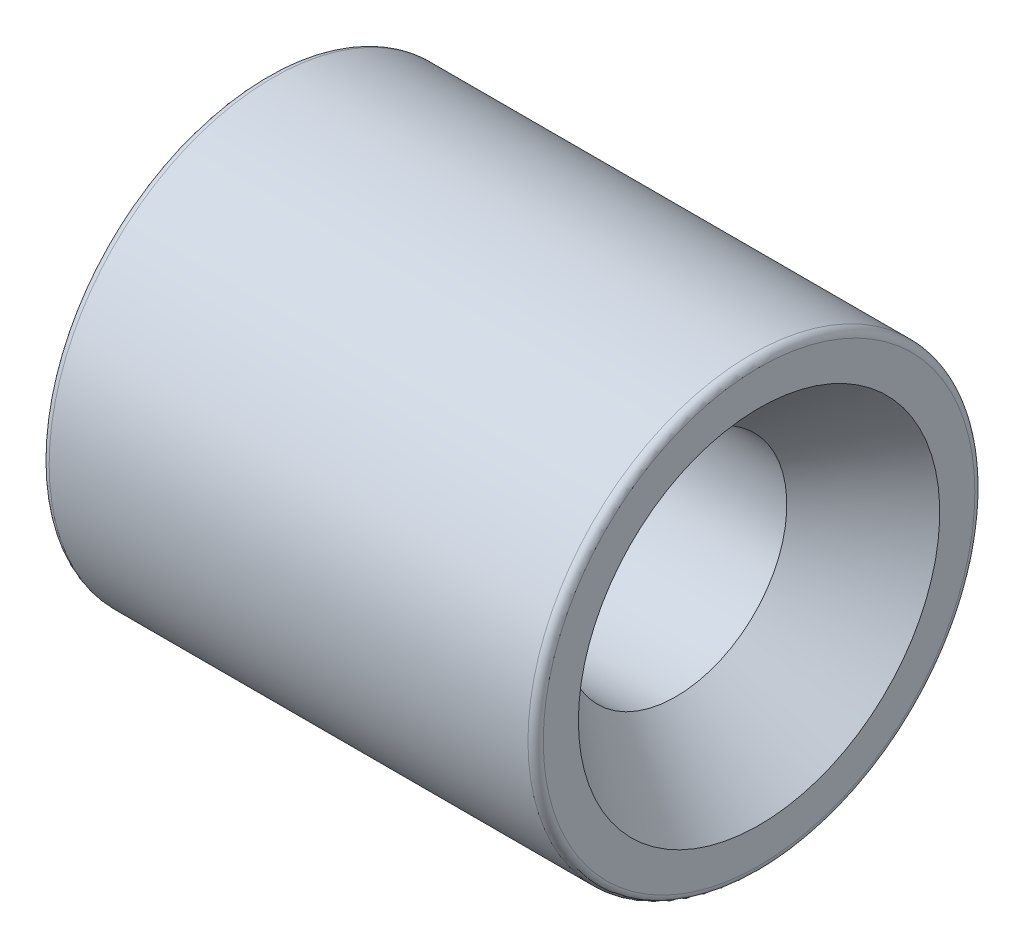
ISO-10303-21;
HEADER;
FILE_DESCRIPTION(('STEP AP214'),'2;1');
FILE_NAME('part.step','',(''),(''),'','','');
FILE_SCHEMA(('AUTOMOTIVE_DESIGN { 1 0 10303 214 1 1 1 1 }'));
ENDSEC;
DATA;
#1=APPLICATION_CONTEXT('core data for automotive mechanical design processes');
#2=APPLICATION_PROTOCOL_DEFINITION('international standard','automotive_design',2000,#1);
#3=PRODUCT_CONTEXT('',#1,'mechanical');
#4=PRODUCT('Part','Part','',(#3));
#5=PRODUCT_RELATED_PRODUCT_CATEGORY('part','',(#4));
#6=PRODUCT_DEFINITION_FORMATION('','',#4);
#7=PRODUCT_DEFINITION_CONTEXT('part definition',#1,'design');
#8=PRODUCT_DEFINITION('design','',#6,#7);
#9=PRODUCT_DEFINITION_SHAPE('','',#8);
#10=(LENGTH_UNIT() NAMED_UNIT(*) SI_UNIT(.MILLI.,.METRE.));
#11=(NAMED_UNIT(*) PLANE_ANGLE_UNIT() SI_UNIT($,.RADIAN.));
#12=(NAMED_UNIT(*) SI_UNIT($,.STERADIAN.) SOLID_ANGLE_UNIT());
#13=UNCERTAINTY_MEASURE_WITH_UNIT(LENGTH_MEASURE(1.E-05),#10,'distance_accuracy_value','');
#14=(GEOMETRIC_REPRESENTATION_CONTEXT(3) GLOBAL_UNCERTAINTY_ASSIGNED_CONTEXT((#13)) GLOBAL_UNIT_ASSIGNED_CONTEXT((#10,
#11,#12)) REPRESENTATION_CONTEXT('',''));
#15=CARTESIAN_POINT('',(0.,0.,0.));
#16=DIRECTION('',(0.,0.,1.));
#17=DIRECTION('',(1.,0.,0.));
#18=AXIS2_PLACEMENT_3D('',#15,#16,#17);
#19=CARTESIAN_POINT('',(0.,-17.3726106353289,0.));
#20=DIRECTION('',(1.,0.,0.));
#21=DIRECTION('',(0.,0.,-1.));
#22=AXIS2_PLACEMENT_3D('',#19,#20,#21);
#23=CONICAL_SURFACE('',#22,17.3726106353289,0.698131700797726);
#24=CARTESIAN_POINT('',(13.0227555330227,-17.3726106353289,0.));
#25=DIRECTION('',(-1.,0.,0.));
#26=DIRECTION('',(0.,0.,1.));
#27=AXIS2_PLACEMENT_3D('',#24,#25,#26);
#28=CIRCLE('',#27,28.3);
#29=CARTESIAN_POINT('',(13.0227555330227,-17.3726106353289,28.3));
#30=VERTEX_POINT('',#29);
#31=EDGE_CURVE('E10',#30,#30,#28,.T.);
#32=ORIENTED_EDGE('',*,*,#31,.F.);
#33=EDGE_LOOP('',(#32));
#34=FACE_BOUND('',#33,.T.);
#35=CARTESIAN_POINT('',(0.,-17.3726106353289,0.));
#36=DIRECTION('',(-1.,0.,0.));
#37=DIRECTION('',(0.,0.,1.));
#38=AXIS2_PLACEMENT_3D('',#35,#36,#37);
#39=CIRCLE('',#38,17.3726106353289);
#40=CARTESIAN_POINT('',(0.,-17.3726106353289,17.3726106353289));
#41=VERTEX_POINT('',#40);
#42=EDGE_CURVE('E59',#41,#41,#39,.T.);
#43=ORIENTED_EDGE('',*,*,#42,.T.);
#44=EDGE_LOOP('',(#43));
#45=FACE_BOUND('',#44,.T.);
#46=ADVANCED_FACE('F31',(#34,#45),#23,.F.);
#47=CARTESIAN_POINT('',(13.0227555330227,16.4273893646711,0.));
#48=DIRECTION('',(-1.,0.,0.));
#49=DIRECTION('',(0.,0.,1.));
#50=AXIS2_PLACEMENT_3D('',#47,#48,#49);
#51=PLANE('',#50);
#52=CARTESIAN_POINT('',(13.0227555330227,-17.3726106353289,0.));
#53=DIRECTION('',(-1.,0.,0.));
#54=DIRECTION('',(0.,0.,1.));
#55=AXIS2_PLACEMENT_3D('',#52,#53,#54);
#56=CIRCLE('',#55,33.8);
#57=CARTESIAN_POINT('',(13.0227555330227,-17.3726106353289,33.8));
#58=VERTEX_POINT('',#57);
#59=EDGE_CURVE('E37',#58,#58,#56,.T.);
#60=ORIENTED_EDGE('',*,*,#59,.F.);
#61=EDGE_LOOP('',(#60));
#62=FACE_BOUND('',#61,.T.);
#63=ORIENTED_EDGE('',*,*,#31,.T.);
#64=EDGE_LOOP('',(#63));
#65=FACE_BOUND('',#64,.T.);
#66=ADVANCED_FACE('F96',(#62,#65),#51,.F.);
#67=CARTESIAN_POINT('',(11.8227555330227,-17.3726106353289,0.));
#68=DIRECTION('',(-1.,0.,0.));
#69=DIRECTION('',(0.,0.,1.));
#70=AXIS2_PLACEMENT_3D('',#67,#68,#69);
#71=TOROIDAL_SURFACE('',#70,33.8,1.2);
#72=CARTESIAN_POINT('',(11.8227555330227,-17.3726106353289,0.));
#73=DIRECTION('',(-1.,0.,0.));
#74=DIRECTION('',(0.,0.,1.));
#75=AXIS2_PLACEMENT_3D('',#72,#73,#74);
#76=CIRCLE('',#75,35.);
#77=CARTESIAN_POINT('',(11.8227555330227,-17.3726106353289,35.));
#78=VERTEX_POINT('',#77);
#79=EDGE_CURVE('E41',#78,#78,#76,.T.);
#80=ORIENTED_EDGE('',*,*,#79,.F.);
#81=EDGE_LOOP('',(#80));
#82=FACE_BOUND('',#81,.T.);
#83=ORIENTED_EDGE('',*,*,#59,.T.);
#84=EDGE_LOOP('',(#83));
#85=FACE_BOUND('',#84,.T.);
#86=ADVANCED_FACE('F91',(#82,#85),#71,.T.);
#87=CARTESIAN_POINT('',(-93.7858741065882,-17.3726106353289,0.));
#88=DIRECTION('',(-1.,0.,0.));
#89=DIRECTION('',(0.,0.,1.));
#90=AXIS2_PLACEMENT_3D('',#87,#88,#89);
#91=CYLINDRICAL_SURFACE('',#90,35.);
#92=CARTESIAN_POINT('',(-63.1772444669773,-17.3726106353289,0.));
#93=DIRECTION('',(-1.,0.,0.));
#94=DIRECTION('',(0.,0.,1.));
#95=AXIS2_PLACEMENT_3D('',#92,#93,#94);
#96=CIRCLE('',#95,35.);
#97=CARTESIAN_POINT('',(-63.1772444669773,-17.3726106353289,35.));
#98=VERTEX_POINT('',#97);
#99=EDGE_CURVE('E45',#98,#98,#96,.T.);
#100=ORIENTED_EDGE('',*,*,#99,.F.);
#101=EDGE_LOOP('',(#100));
#102=FACE_BOUND('',#101,.T.);
#103=ORIENTED_EDGE('',*,*,#79,.T.);
#104=EDGE_LOOP('',(#103));
#105=FACE_BOUND('',#104,.T.);
#106=ADVANCED_FACE('F85',(#102,#105),#91,.T.);
#107=CARTESIAN_POINT('',(-63.1772444669773,-17.3726106353289,0.));
#108=DIRECTION('',(-1.,0.,0.));
#109=DIRECTION('',(0.,0.,1.));
#110=AXIS2_PLACEMENT_3D('',#107,#108,#109);
#111=TOROIDAL_SURFACE('',#110,33.8,1.2);
#112=CARTESIAN_POINT('',(-64.3772444669773,-17.3726106353289,0.));
#113=DIRECTION('',(-1.,0.,0.));
#114=DIRECTION('',(0.,0.,1.));
#115=AXIS2_PLACEMENT_3D('',#112,#113,#114);
#116=CIRCLE('',#115,33.8);
#117=CARTESIAN_POINT('',(-64.3772444669773,-17.3726106353289,33.8));
#118=VERTEX_POINT('',#117);
#119=EDGE_CURVE('E50',#118,#118,#116,.T.);
#120=ORIENTED_EDGE('',*,*,#119,.F.);
#121=EDGE_LOOP('',(#120));
#122=FACE_BOUND('',#121,.T.);
#123=ORIENTED_EDGE('',*,*,#99,.T.);
#124=EDGE_LOOP('',(#123));
#125=FACE_BOUND('',#124,.T.);
#126=ADVANCED_FACE('F79',(#122,#125),#111,.T.);
#127=CARTESIAN_POINT('',(-64.3772444669773,16.4273893646711,0.));
#128=DIRECTION('',(1.,0.,0.));
#129=DIRECTION('',(0.,0.,-1.));
#130=AXIS2_PLACEMENT_3D('',#127,#128,#129);
#131=PLANE('',#130);
#132=CARTESIAN_POINT('',(-64.3772444669773,-17.3726106353289,0.));
#133=DIRECTION('',(-1.,0.,0.));
#134=DIRECTION('',(0.,0.,1.));
#135=AXIS2_PLACEMENT_3D('',#132,#133,#134);
#136=CIRCLE('',#135,28.3);
#137=CARTESIAN_POINT('',(-64.3772444669773,-17.3726106353289,28.3));
#138=VERTEX_POINT('',#137);
#139=EDGE_CURVE('E53',#138,#138,#136,.T.);
#140=ORIENTED_EDGE('',*,*,#139,.F.);
#141=EDGE_LOOP('',(#140));
#142=FACE_BOUND('',#141,.T.);
#143=ORIENTED_EDGE('',*,*,#119,.T.);
#144=EDGE_LOOP('',(#143));
#145=FACE_BOUND('',#144,.T.);
#146=ADVANCED_FACE('F73',(#142,#145),#131,.F.);
#147=CARTESIAN_POINT('',(-64.3772444669773,-17.3726106353289,0.));
#148=DIRECTION('',(-1.,0.,0.));
#149=DIRECTION('',(0.,0.,1.));
#150=AXIS2_PLACEMENT_3D('',#147,#148,#149);
#151=CONICAL_SURFACE('',#150,28.3,0.698131700797726);
#152=CARTESIAN_POINT('',(-51.3544889339546,-17.3726106353289,0.));
#153=DIRECTION('',(-1.,0.,0.));
#154=DIRECTION('',(0.,0.,1.));
#155=AXIS2_PLACEMENT_3D('',#152,#153,#154);
#156=CIRCLE('',#155,17.3726106353289);
#157=CARTESIAN_POINT('',(-51.3544889339546,-17.3726106353289,17.3726106353289));
#158=VERTEX_POINT('',#157);
#159=EDGE_CURVE('E56',#158,#158,#156,.T.);
#160=ORIENTED_EDGE('',*,*,#159,.F.);
#161=EDGE_LOOP('',(#160));
#162=FACE_BOUND('',#161,.T.);
#163=ORIENTED_EDGE('',*,*,#139,.T.);
#164=EDGE_LOOP('',(#163));
#165=FACE_BOUND('',#164,.T.);
#166=ADVANCED_FACE('F67',(#162,#165),#151,.F.);
#167=CARTESIAN_POINT('',(-93.7858741065882,-17.3726106353289,0.));
#168=DIRECTION('',(-1.,0.,0.));
#169=DIRECTION('',(0.,0.,1.));
#170=AXIS2_PLACEMENT_3D('',#167,#168,#169);
#171=CYLINDRICAL_SURFACE('',#170,17.3726106353289);
#172=ORIENTED_EDGE('',*,*,#42,.F.);
#173=EDGE_LOOP('',(#172));
#174=FACE_BOUND('',#173,.T.);
#175=ORIENTED_EDGE('',*,*,#159,.T.);
#176=EDGE_LOOP('',(#175));
#177=FACE_BOUND('',#176,.T.);
#178=ADVANCED_FACE('F64',(#174,#177),#171,.F.);
#179=CLOSED_SHELL('',(#46,#66,#86,#106,#126,#146,#166,#178));
#180=MANIFOLD_SOLID_BREP('B2',#179);
#181=ADVANCED_BREP_SHAPE_REPRESENTATION('',(#18,#180),#14);
#182=SHAPE_DEFINITION_REPRESENTATION(#9,#181);
ENDSEC;
END-ISO-10303-21;
